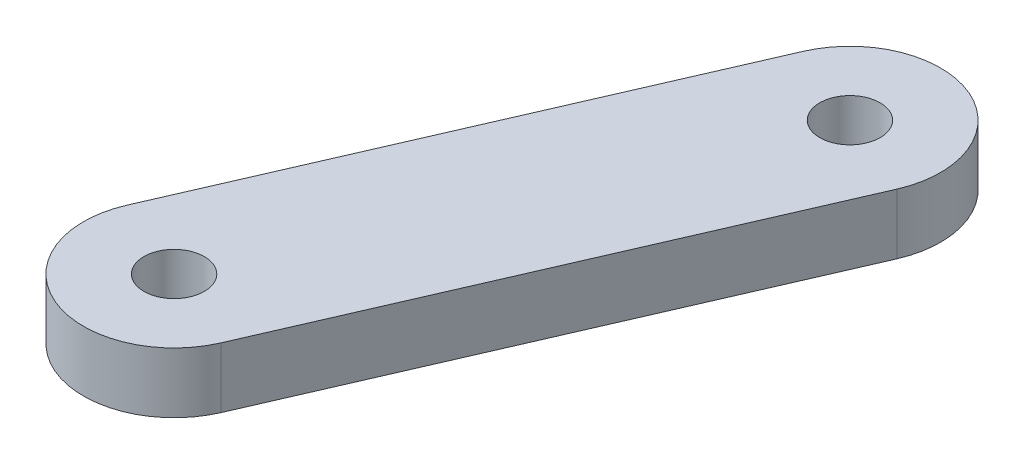
ISO-10303-21;
HEADER;
FILE_DESCRIPTION(('STEP AP214'),'2;1');
FILE_NAME('part.step','',(''),(''),'','','');
FILE_SCHEMA(('AUTOMOTIVE_DESIGN { 1 0 10303 214 1 1 1 1 }'));
ENDSEC;
DATA;
#1=APPLICATION_CONTEXT('core data for automotive mechanical design processes');
#2=APPLICATION_PROTOCOL_DEFINITION('international standard','automotive_design',2000,#1);
#3=PRODUCT_CONTEXT('',#1,'mechanical');
#4=PRODUCT('Part','Part','',(#3));
#5=PRODUCT_RELATED_PRODUCT_CATEGORY('part','',(#4));
#6=PRODUCT_DEFINITION_FORMATION('','',#4);
#7=PRODUCT_DEFINITION_CONTEXT('part definition',#1,'design');
#8=PRODUCT_DEFINITION('design','',#6,#7);
#9=PRODUCT_DEFINITION_SHAPE('','',#8);
#10=(LENGTH_UNIT() NAMED_UNIT(*) SI_UNIT(.MILLI.,.METRE.));
#11=(NAMED_UNIT(*) PLANE_ANGLE_UNIT() SI_UNIT($,.RADIAN.));
#12=(NAMED_UNIT(*) SI_UNIT($,.STERADIAN.) SOLID_ANGLE_UNIT());
#13=UNCERTAINTY_MEASURE_WITH_UNIT(LENGTH_MEASURE(1.E-05),#10,'distance_accuracy_value','');
#14=(GEOMETRIC_REPRESENTATION_CONTEXT(3) GLOBAL_UNCERTAINTY_ASSIGNED_CONTEXT((#13)) GLOBAL_UNIT_ASSIGNED_CONTEXT((#10,
#11,#12)) REPRESENTATION_CONTEXT('',''));
#15=CARTESIAN_POINT('',(0.,0.,0.));
#16=DIRECTION('',(0.,0.,1.));
#17=DIRECTION('',(1.,0.,0.));
#18=AXIS2_PLACEMENT_3D('',#15,#16,#17);
#19=CARTESIAN_POINT('',(29.9681685848032,-5.,-61.1619990747981));
#20=DIRECTION('',(0.,1.,0.));
#21=DIRECTION('',(0.,0.,1.));
#22=AXIS2_PLACEMENT_3D('',#19,#20,#21);
#23=CYLINDRICAL_SURFACE('',#22,7.49926131403119);
#24=CARTESIAN_POINT('',(29.9681685848032,0.,-61.1619990747981));
#25=DIRECTION('',(0.,1.,0.));
#26=DIRECTION('',(0.,0.,1.));
#27=AXIS2_PLACEMENT_3D('',#24,#25,#26);
#28=CIRCLE('',#27,7.49926131403119);
#29=CARTESIAN_POINT('',(23.0905406659115,0.,-64.1515064699063));
#30=VERTEX_POINT('',#29);
#31=CARTESIAN_POINT('',(36.8457965036949,0.,-58.17249167969));
#32=VERTEX_POINT('',#31);
#33=EDGE_CURVE('E104',#30,#32,#28,.T.);
#34=ORIENTED_EDGE('',*,*,#33,.F.);
#35=DIRECTION('',(0.,1.,0.));
#36=VECTOR('',#35,1.);
#37=CARTESIAN_POINT('',(23.0905406659115,-5.,-64.1515064699063));
#38=LINE('',#37,#36);
#39=CARTESIAN_POINT('',(23.0905406659115,-5.,-64.1515064699063));
#40=VERTEX_POINT('',#39);
#41=EDGE_CURVE('E11',#40,#30,#38,.T.);
#42=ORIENTED_EDGE('',*,*,#41,.F.);
#43=CARTESIAN_POINT('',(29.9681685848032,-5.,-61.1619990747981));
#44=DIRECTION('',(0.,1.,0.));
#45=DIRECTION('',(0.,0.,1.));
#46=AXIS2_PLACEMENT_3D('',#43,#44,#45);
#47=CIRCLE('',#46,7.49926131403119);
#48=CARTESIAN_POINT('',(36.8457965036949,-5.,-58.17249167969));
#49=VERTEX_POINT('',#48);
#50=EDGE_CURVE('E97',#40,#49,#47,.T.);
#51=ORIENTED_EDGE('',*,*,#50,.T.);
#52=DIRECTION('',(0.,1.,0.));
#53=VECTOR('',#52,1.);
#54=CARTESIAN_POINT('',(36.8457965036949,-5.,-58.17249167969));
#55=LINE('',#54,#53);
#56=EDGE_CURVE('E42',#49,#32,#55,.T.);
#57=ORIENTED_EDGE('',*,*,#56,.T.);
#58=EDGE_LOOP('',(#34,#42,#51,#57));
#59=FACE_BOUND('',#58,.T.);
#60=ADVANCED_FACE('F39',(#59),#23,.T.);
#61=CARTESIAN_POINT('',(40.0327512346212,-5.,-103.128570251642));
#62=DIRECTION('',(-0.917107383099666,0.,-0.398640248675522));
#63=DIRECTION('',(-0.398640248675523,0.,0.917107383099666));
#64=AXIS2_PLACEMENT_3D('',#61,#62,#63);
#65=PLANE('',#64);
#66=DIRECTION('',(-0.398640248675522,0.,0.917107383099666));
#67=VECTOR('',#66,1.);
#68=CARTESIAN_POINT('',(40.0327512346212,0.,-103.128570251642));
#69=LINE('',#68,#67);
#70=CARTESIAN_POINT('',(40.0327512346212,0.,-103.128570251642));
#71=VERTEX_POINT('',#70);
#72=EDGE_CURVE('E99',#71,#30,#69,.T.);
#73=ORIENTED_EDGE('',*,*,#72,.F.);
#74=DIRECTION('',(0.,1.,0.));
#75=VECTOR('',#74,1.);
#76=CARTESIAN_POINT('',(40.0327512346212,-5.,-103.128570251642));
#77=LINE('',#76,#75);
#78=CARTESIAN_POINT('',(40.0327512346212,-5.,-103.128570251642));
#79=VERTEX_POINT('',#78);
#80=EDGE_CURVE('E48',#79,#71,#77,.T.);
#81=ORIENTED_EDGE('',*,*,#80,.F.);
#82=DIRECTION('',(-0.398640248675522,0.,0.917107383099666));
#83=VECTOR('',#82,1.);
#84=CARTESIAN_POINT('',(40.0327512346212,-5.,-103.128570251642));
#85=LINE('',#84,#83);
#86=EDGE_CURVE('E94',#79,#40,#85,.T.);
#87=ORIENTED_EDGE('',*,*,#86,.T.);
#88=ORIENTED_EDGE('',*,*,#41,.T.);
#89=EDGE_LOOP('',(#73,#81,#87,#88));
#90=FACE_BOUND('',#89,.T.);
#91=ADVANCED_FACE('F115',(#90),#65,.T.);
#92=CARTESIAN_POINT('',(46.9103791535129,-5.,-100.139062856534));
#93=DIRECTION('',(0.,1.,0.));
#94=DIRECTION('',(0.,0.,1.));
#95=AXIS2_PLACEMENT_3D('',#92,#93,#94);
#96=CYLINDRICAL_SURFACE('',#95,7.49926131403121);
#97=CARTESIAN_POINT('',(46.9103791535129,0.,-100.139062856534));
#98=DIRECTION('',(0.,1.,0.));
#99=DIRECTION('',(0.,0.,1.));
#100=AXIS2_PLACEMENT_3D('',#97,#98,#99);
#101=CIRCLE('',#100,7.49926131403121);
#102=CARTESIAN_POINT('',(53.7880070724047,0.,-97.1495554614258));
#103=VERTEX_POINT('',#102);
#104=EDGE_CURVE('E89',#103,#71,#101,.T.);
#105=ORIENTED_EDGE('',*,*,#104,.F.);
#106=DIRECTION('',(0.,1.,0.));
#107=VECTOR('',#106,1.);
#108=CARTESIAN_POINT('',(53.7880070724047,-5.,-97.1495554614258));
#109=LINE('',#108,#107);
#110=CARTESIAN_POINT('',(53.7880070724047,-5.,-97.1495554614258));
#111=VERTEX_POINT('',#110);
#112=EDGE_CURVE('E84',#111,#103,#109,.T.);
#113=ORIENTED_EDGE('',*,*,#112,.F.);
#114=CARTESIAN_POINT('',(46.9103791535129,-5.,-100.139062856534));
#115=DIRECTION('',(0.,1.,0.));
#116=DIRECTION('',(0.,0.,1.));
#117=AXIS2_PLACEMENT_3D('',#114,#115,#116);
#118=CIRCLE('',#117,7.49926131403121);
#119=EDGE_CURVE('E87',#111,#79,#118,.T.);
#120=ORIENTED_EDGE('',*,*,#119,.T.);
#121=ORIENTED_EDGE('',*,*,#80,.T.);
#122=EDGE_LOOP('',(#105,#113,#120,#121));
#123=FACE_BOUND('',#122,.T.);
#124=ADVANCED_FACE('F86',(#123),#96,.T.);
#125=CARTESIAN_POINT('',(53.7880070724047,-5.,-97.1495554614258));
#126=DIRECTION('',(0.917107383099666,0.,0.398640248675523));
#127=DIRECTION('',(0.398640248675523,0.,-0.917107383099666));
#128=AXIS2_PLACEMENT_3D('',#125,#126,#127);
#129=PLANE('',#128);
#130=DIRECTION('',(0.398640248675523,0.,-0.917107383099666));
#131=VECTOR('',#130,1.);
#132=CARTESIAN_POINT('',(53.7880070724047,0.,-97.1495554614258));
#133=LINE('',#132,#131);
#134=EDGE_CURVE('E107',#32,#103,#133,.T.);
#135=ORIENTED_EDGE('',*,*,#134,.F.);
#136=ORIENTED_EDGE('',*,*,#56,.F.);
#137=DIRECTION('',(0.398640248675523,0.,-0.917107383099666));
#138=VECTOR('',#137,1.);
#139=CARTESIAN_POINT('',(53.7880070724047,-5.,-97.1495554614258));
#140=LINE('',#139,#138);
#141=EDGE_CURVE('E93',#49,#111,#140,.T.);
#142=ORIENTED_EDGE('',*,*,#141,.T.);
#143=ORIENTED_EDGE('',*,*,#112,.T.);
#144=EDGE_LOOP('',(#135,#136,#142,#143));
#145=FACE_BOUND('',#144,.T.);
#146=ADVANCED_FACE('F96',(#145),#129,.T.);
#147=CARTESIAN_POINT('',(29.9681685848032,-5.,-61.1619990747981));
#148=DIRECTION('',(0.,1.,0.));
#149=DIRECTION('',(0.,0.,1.));
#150=AXIS2_PLACEMENT_3D('',#147,#148,#149);
#151=PLANE('',#150);
#152=CARTESIAN_POINT('',(46.9103791535129,-5.,-100.139062856534));
#153=DIRECTION('',(0.,1.,0.));
#154=DIRECTION('',(0.,0.,1.));
#155=AXIS2_PLACEMENT_3D('',#152,#153,#154);
#156=CIRCLE('',#155,2.5);
#157=CARTESIAN_POINT('',(46.9103791535129,-5.,-97.6390628565339));
#158=VERTEX_POINT('',#157);
#159=EDGE_CURVE('E148',#158,#158,#156,.T.);
#160=ORIENTED_EDGE('',*,*,#159,.T.);
#161=EDGE_LOOP('',(#160));
#162=FACE_BOUND('',#161,.T.);
#163=CARTESIAN_POINT('',(29.9681685848032,-5.,-61.1619990747981));
#164=DIRECTION('',(0.,1.,0.));
#165=DIRECTION('',(0.,0.,1.));
#166=AXIS2_PLACEMENT_3D('',#163,#164,#165);
#167=CIRCLE('',#166,2.50000000000001);
#168=CARTESIAN_POINT('',(29.9681685848032,-5.,-58.6619990747981));
#169=VERTEX_POINT('',#168);
#170=EDGE_CURVE('E108',#169,#169,#167,.T.);
#171=ORIENTED_EDGE('',*,*,#170,.T.);
#172=EDGE_LOOP('',(#171));
#173=FACE_BOUND('',#172,.T.);
#174=ORIENTED_EDGE('',*,*,#50,.F.);
#175=ORIENTED_EDGE('',*,*,#86,.F.);
#176=ORIENTED_EDGE('',*,*,#119,.F.);
#177=ORIENTED_EDGE('',*,*,#141,.F.);
#178=EDGE_LOOP('',(#174,#175,#176,#177));
#179=FACE_BOUND('',#178,.T.);
#180=ADVANCED_FACE('F92',(#162,#173,#179),#151,.F.);
#181=CARTESIAN_POINT('',(29.9681685848032,0.,-61.1619990747981));
#182=DIRECTION('',(0.,1.,0.));
#183=DIRECTION('',(0.,0.,1.));
#184=AXIS2_PLACEMENT_3D('',#181,#182,#183);
#185=PLANE('',#184);
#186=CARTESIAN_POINT('',(46.9103791535129,0.,-100.139062856534));
#187=DIRECTION('',(0.,1.,0.));
#188=DIRECTION('',(0.,0.,1.));
#189=AXIS2_PLACEMENT_3D('',#186,#187,#188);
#190=CIRCLE('',#189,2.5);
#191=CARTESIAN_POINT('',(46.9103791535129,0.,-97.6390628565339));
#192=VERTEX_POINT('',#191);
#193=EDGE_CURVE('E151',#192,#192,#190,.T.);
#194=ORIENTED_EDGE('',*,*,#193,.F.);
#195=EDGE_LOOP('',(#194));
#196=FACE_BOUND('',#195,.T.);
#197=CARTESIAN_POINT('',(29.9681685848032,0.,-61.1619990747981));
#198=DIRECTION('',(0.,1.,0.));
#199=DIRECTION('',(0.,0.,1.));
#200=AXIS2_PLACEMENT_3D('',#197,#198,#199);
#201=CIRCLE('',#200,2.50000000000001);
#202=CARTESIAN_POINT('',(29.9681685848032,0.,-58.6619990747981));
#203=VERTEX_POINT('',#202);
#204=EDGE_CURVE('E153',#203,#203,#201,.T.);
#205=ORIENTED_EDGE('',*,*,#204,.F.);
#206=EDGE_LOOP('',(#205));
#207=FACE_BOUND('',#206,.T.);
#208=ORIENTED_EDGE('',*,*,#33,.T.);
#209=ORIENTED_EDGE('',*,*,#134,.T.);
#210=ORIENTED_EDGE('',*,*,#104,.T.);
#211=ORIENTED_EDGE('',*,*,#72,.T.);
#212=EDGE_LOOP('',(#208,#209,#210,#211));
#213=FACE_BOUND('',#212,.T.);
#214=ADVANCED_FACE('F114',(#196,#207,#213),#185,.T.);
#215=CARTESIAN_POINT('',(29.9681685848032,-5.,-61.1619990747981));
#216=DIRECTION('',(0.,1.,0.));
#217=DIRECTION('',(0.,0.,1.));
#218=AXIS2_PLACEMENT_3D('',#215,#216,#217);
#219=CYLINDRICAL_SURFACE('',#218,2.50000000000001);
#220=ORIENTED_EDGE('',*,*,#170,.F.);
#221=EDGE_LOOP('',(#220));
#222=FACE_BOUND('',#221,.T.);
#223=ORIENTED_EDGE('',*,*,#204,.T.);
#224=EDGE_LOOP('',(#223));
#225=FACE_BOUND('',#224,.T.);
#226=ADVANCED_FACE('F133',(#222,#225),#219,.F.);
#227=CARTESIAN_POINT('',(46.9103791535129,-5.,-100.139062856534));
#228=DIRECTION('',(0.,1.,0.));
#229=DIRECTION('',(0.,0.,1.));
#230=AXIS2_PLACEMENT_3D('',#227,#228,#229);
#231=CYLINDRICAL_SURFACE('',#230,2.5);
#232=ORIENTED_EDGE('',*,*,#159,.F.);
#233=EDGE_LOOP('',(#232));
#234=FACE_BOUND('',#233,.T.);
#235=ORIENTED_EDGE('',*,*,#193,.T.);
#236=EDGE_LOOP('',(#235));
#237=FACE_BOUND('',#236,.T.);
#238=ADVANCED_FACE('F140',(#234,#237),#231,.F.);
#239=CLOSED_SHELL('',(#60,#91,#124,#146,#180,#214,#226,#238));
#240=MANIFOLD_SOLID_BREP('B2',#239);
#241=ADVANCED_BREP_SHAPE_REPRESENTATION('',(#18,#240),#14);
#242=SHAPE_DEFINITION_REPRESENTATION(#9,#241);
ENDSEC;
END-ISO-10303-21;
